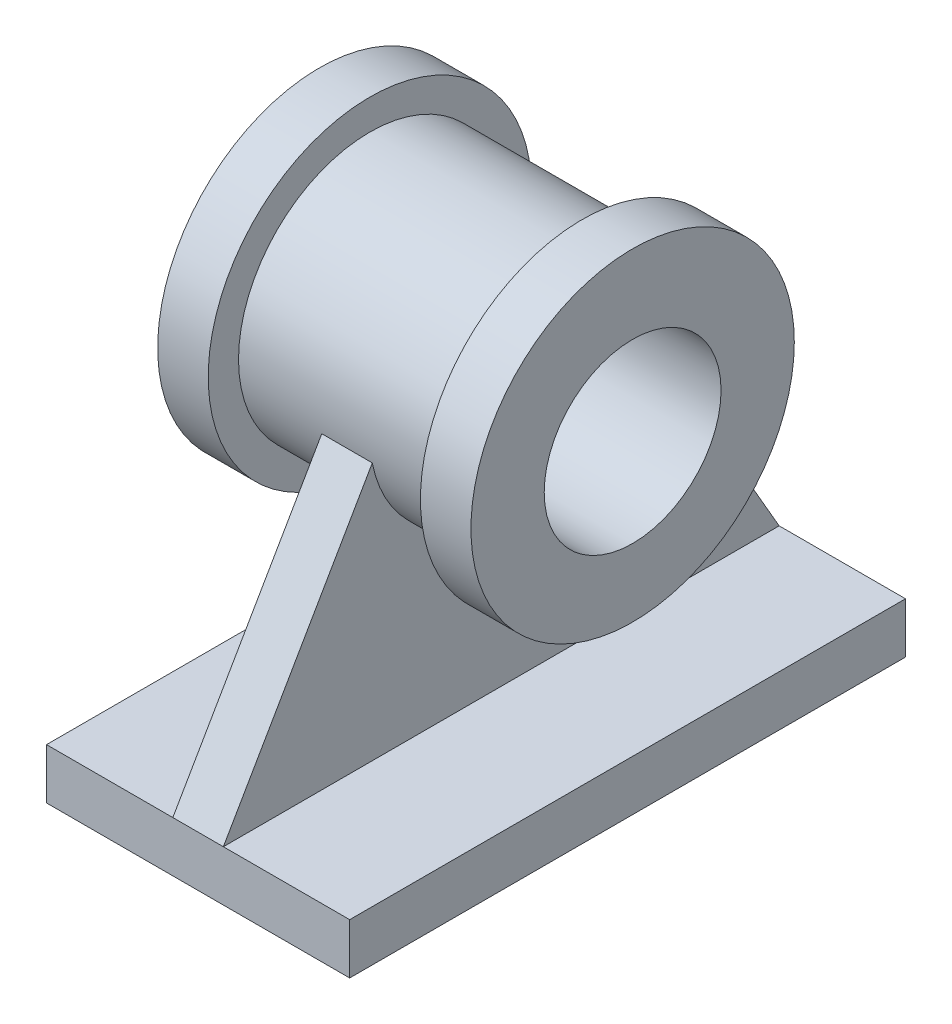
ISO-10303-21;
HEADER;
FILE_DESCRIPTION(('STEP AP214'),'2;1');
FILE_NAME('part.step','',(''),(''),'','','');
FILE_SCHEMA(('AUTOMOTIVE_DESIGN { 1 0 10303 214 1 1 1 1 }'));
ENDSEC;
DATA;
#1=APPLICATION_CONTEXT('core data for automotive mechanical design processes');
#2=APPLICATION_PROTOCOL_DEFINITION('international standard','automotive_design',2000,#1);
#3=PRODUCT_CONTEXT('',#1,'mechanical');
#4=PRODUCT('Part','Part','',(#3));
#5=PRODUCT_RELATED_PRODUCT_CATEGORY('part','',(#4));
#6=PRODUCT_DEFINITION_FORMATION('','',#4);
#7=PRODUCT_DEFINITION_CONTEXT('part definition',#1,'design');
#8=PRODUCT_DEFINITION('design','',#6,#7);
#9=PRODUCT_DEFINITION_SHAPE('','',#8);
#10=(LENGTH_UNIT() NAMED_UNIT(*) SI_UNIT(.MILLI.,.METRE.));
#11=(NAMED_UNIT(*) PLANE_ANGLE_UNIT() SI_UNIT($,.RADIAN.));
#12=(NAMED_UNIT(*) SI_UNIT($,.STERADIAN.) SOLID_ANGLE_UNIT());
#13=UNCERTAINTY_MEASURE_WITH_UNIT(LENGTH_MEASURE(1.E-05),#10,'distance_accuracy_value','');
#14=(GEOMETRIC_REPRESENTATION_CONTEXT(3) GLOBAL_UNCERTAINTY_ASSIGNED_CONTEXT((#13)) GLOBAL_UNIT_ASSIGNED_CONTEXT((#10,
#11,#12)) REPRESENTATION_CONTEXT('',''));
#15=CARTESIAN_POINT('',(0.,0.,0.));
#16=DIRECTION('',(0.,0.,1.));
#17=DIRECTION('',(1.,0.,0.));
#18=AXIS2_PLACEMENT_3D('',#15,#16,#17);
#19=CARTESIAN_POINT('',(5.,95.,-55.));
#20=DIRECTION('',(-1.,0.,0.));
#21=DIRECTION('',(0.,0.,1.));
#22=AXIS2_PLACEMENT_3D('',#19,#20,#21);
#23=PLANE('',#22);
#24=CARTESIAN_POINT('',(5.,66.,0.));
#25=DIRECTION('',(-1.,0.,0.));
#26=DIRECTION('',(0.,0.,1.));
#27=AXIS2_PLACEMENT_3D('',#24,#25,#26);
#28=CIRCLE('',#27,26.);
#29=CARTESIAN_POINT('',(5.,61.0523594579969,25.5249065241604));
#30=VERTEX_POINT('',#29);
#31=CARTESIAN_POINT('',(5.,61.0523594579969,-25.5249065241604));
#32=VERTEX_POINT('',#31);
#33=EDGE_CURVE('E51',#30,#32,#28,.F.);
#34=ORIENTED_EDGE('',*,*,#33,.F.);
#35=DIRECTION('',(0.,0.866025403784442,-0.499999999999995));
#36=VECTOR('',#35,1.);
#37=CARTESIAN_POINT('',(5.,10.,55.));
#38=LINE('',#37,#36);
#39=CARTESIAN_POINT('',(5.,10.,55.));
#40=VERTEX_POINT('',#39);
#41=EDGE_CURVE('E128',#40,#30,#38,.T.);
#42=ORIENTED_EDGE('',*,*,#41,.F.);
#43=DIRECTION('',(0.,0.,-1.));
#44=VECTOR('',#43,1.);
#45=CARTESIAN_POINT('',(5.,10.,-55.));
#46=LINE('',#45,#44);
#47=CARTESIAN_POINT('',(5.,10.,-55.));
#48=VERTEX_POINT('',#47);
#49=EDGE_CURVE('E139',#40,#48,#46,.T.);
#50=ORIENTED_EDGE('',*,*,#49,.T.);
#51=DIRECTION('',(0.,0.866025403784442,0.499999999999995));
#52=VECTOR('',#51,1.);
#53=CARTESIAN_POINT('',(5.,10.,-55.));
#54=LINE('',#53,#52);
#55=EDGE_CURVE('E133',#48,#32,#54,.T.);
#56=ORIENTED_EDGE('',*,*,#55,.T.);
#57=EDGE_LOOP('',(#34,#42,#50,#56));
#58=FACE_BOUND('',#57,.T.);
#59=ADVANCED_FACE('F35',(#58),#23,.F.);
#60=CARTESIAN_POINT('',(-5.,95.,-55.));
#61=DIRECTION('',(1.,0.,0.));
#62=DIRECTION('',(0.,0.,-1.));
#63=AXIS2_PLACEMENT_3D('',#60,#61,#62);
#64=PLANE('',#63);
#65=CARTESIAN_POINT('',(-5.,66.,0.));
#66=DIRECTION('',(1.,0.,0.));
#67=DIRECTION('',(0.,0.,-1.));
#68=AXIS2_PLACEMENT_3D('',#65,#66,#67);
#69=CIRCLE('',#68,26.);
#70=CARTESIAN_POINT('',(-5.,61.0523594579969,-25.5249065241604));
#71=VERTEX_POINT('',#70);
#72=CARTESIAN_POINT('',(-5.,61.0523594579969,25.5249065241604));
#73=VERTEX_POINT('',#72);
#74=EDGE_CURVE('E111',#71,#73,#69,.F.);
#75=ORIENTED_EDGE('',*,*,#74,.F.);
#76=DIRECTION('',(0.,0.866025403784442,0.499999999999995));
#77=VECTOR('',#76,1.);
#78=CARTESIAN_POINT('',(-5.,73.7500000000005,-18.1939203391616));
#79=LINE('',#78,#77);
#80=CARTESIAN_POINT('',(-5.,10.,-55.));
#81=VERTEX_POINT('',#80);
#82=EDGE_CURVE('E121',#81,#71,#79,.T.);
#83=ORIENTED_EDGE('',*,*,#82,.F.);
#84=DIRECTION('',(0.,0.,1.));
#85=VECTOR('',#84,1.);
#86=CARTESIAN_POINT('',(-5.,10.,-55.));
#87=LINE('',#86,#85);
#88=CARTESIAN_POINT('',(-5.,10.,55.));
#89=VERTEX_POINT('',#88);
#90=EDGE_CURVE('E142',#81,#89,#87,.T.);
#91=ORIENTED_EDGE('',*,*,#90,.T.);
#92=DIRECTION('',(0.,0.866025403784442,-0.499999999999995));
#93=VECTOR('',#92,1.);
#94=CARTESIAN_POINT('',(-5.,121.381397208144,-9.3060796608378));
#95=LINE('',#94,#93);
#96=EDGE_CURVE('E123',#89,#73,#95,.T.);
#97=ORIENTED_EDGE('',*,*,#96,.T.);
#98=EDGE_LOOP('',(#75,#83,#91,#97));
#99=FACE_BOUND('',#98,.T.);
#100=ADVANCED_FACE('F119',(#99),#64,.F.);
#101=CARTESIAN_POINT('',(-80.,10.,55.));
#102=DIRECTION('',(0.,-0.499999999999995,-0.866025403784442));
#103=DIRECTION('',(0.,0.866025403784442,-0.499999999999995));
#104=AXIS2_PLACEMENT_3D('',#101,#102,#103);
#105=PLANE('',#104);
#106=DIRECTION('',(-1.,0.,0.));
#107=VECTOR('',#106,1.);
#108=CARTESIAN_POINT('',(21.,61.0523594579969,25.5249065241604));
#109=LINE('',#108,#107);
#110=EDGE_CURVE('E192',#73,#30,#109,.F.);
#111=ORIENTED_EDGE('',*,*,#110,.F.);
#112=ORIENTED_EDGE('',*,*,#96,.F.);
#113=DIRECTION('',(1.,0.,0.));
#114=VECTOR('',#113,1.);
#115=CARTESIAN_POINT('',(-80.,10.,55.));
#116=LINE('',#115,#114);
#117=EDGE_CURVE('E131',#89,#40,#116,.T.);
#118=ORIENTED_EDGE('',*,*,#117,.T.);
#119=ORIENTED_EDGE('',*,*,#41,.T.);
#120=EDGE_LOOP('',(#111,#112,#118,#119));
#121=FACE_BOUND('',#120,.T.);
#122=ADVANCED_FACE('F191',(#121),#105,.F.);
#123=CARTESIAN_POINT('',(-80.,10.,-55.));
#124=DIRECTION('',(0.,0.499999999999995,-0.866025403784442));
#125=DIRECTION('',(0.,0.866025403784442,0.499999999999995));
#126=AXIS2_PLACEMENT_3D('',#123,#124,#125);
#127=PLANE('',#126);
#128=ORIENTED_EDGE('',*,*,#82,.T.);
#129=DIRECTION('',(-1.,0.,0.));
#130=VECTOR('',#129,1.);
#131=CARTESIAN_POINT('',(21.,61.0523594579969,-25.5249065241604));
#132=LINE('',#131,#130);
#133=EDGE_CURVE('E11',#71,#32,#132,.F.);
#134=ORIENTED_EDGE('',*,*,#133,.T.);
#135=ORIENTED_EDGE('',*,*,#55,.F.);
#136=DIRECTION('',(1.,0.,0.));
#137=VECTOR('',#136,1.);
#138=CARTESIAN_POINT('',(-80.,10.,-55.));
#139=LINE('',#138,#137);
#140=EDGE_CURVE('E127',#81,#48,#139,.T.);
#141=ORIENTED_EDGE('',*,*,#140,.F.);
#142=EDGE_LOOP('',(#128,#134,#135,#141));
#143=FACE_BOUND('',#142,.T.);
#144=ADVANCED_FACE('F126',(#143),#127,.T.);
#145=CARTESIAN_POINT('',(-30.,10.,-55.));
#146=DIRECTION('',(0.,0.,1.));
#147=DIRECTION('',(1.,0.,0.));
#148=AXIS2_PLACEMENT_3D('',#145,#146,#147);
#149=PLANE('',#148);
#150=ORIENTED_EDGE('',*,*,#140,.T.);
#151=DIRECTION('',(-1.,0.,0.));
#152=VECTOR('',#151,1.);
#153=CARTESIAN_POINT('',(-30.,10.,-55.));
#154=LINE('',#153,#152);
#155=CARTESIAN_POINT('',(30.,10.,-55.));
#156=VERTEX_POINT('',#155);
#157=EDGE_CURVE('E89',#156,#48,#154,.T.);
#158=ORIENTED_EDGE('',*,*,#157,.F.);
#159=DIRECTION('',(0.,-1.,0.));
#160=VECTOR('',#159,1.);
#161=CARTESIAN_POINT('',(30.,10.,-55.));
#162=LINE('',#161,#160);
#163=CARTESIAN_POINT('',(30.,0.,-55.));
#164=VERTEX_POINT('',#163);
#165=EDGE_CURVE('E44',#156,#164,#162,.T.);
#166=ORIENTED_EDGE('',*,*,#165,.T.);
#167=DIRECTION('',(-1.,0.,0.));
#168=VECTOR('',#167,1.);
#169=CARTESIAN_POINT('',(-30.,0.,-55.));
#170=LINE('',#169,#168);
#171=CARTESIAN_POINT('',(-30.,0.,-55.));
#172=VERTEX_POINT('',#171);
#173=EDGE_CURVE('E157',#164,#172,#170,.T.);
#174=ORIENTED_EDGE('',*,*,#173,.T.);
#175=DIRECTION('',(0.,-1.,0.));
#176=VECTOR('',#175,1.);
#177=CARTESIAN_POINT('',(-30.,10.,-55.));
#178=LINE('',#177,#176);
#179=CARTESIAN_POINT('',(-30.,10.,-55.));
#180=VERTEX_POINT('',#179);
#181=EDGE_CURVE('E165',#180,#172,#178,.T.);
#182=ORIENTED_EDGE('',*,*,#181,.F.);
#183=EDGE_CURVE('E147',#81,#180,#154,.T.);
#184=ORIENTED_EDGE('',*,*,#183,.F.);
#185=EDGE_LOOP('',(#150,#158,#166,#174,#182,#184));
#186=FACE_BOUND('',#185,.T.);
#187=ADVANCED_FACE('F169',(#186),#149,.F.);
#188=CARTESIAN_POINT('',(0.,10.,0.));
#189=DIRECTION('',(0.,1.,0.));
#190=DIRECTION('',(0.,0.,1.));
#191=AXIS2_PLACEMENT_3D('',#188,#189,#190);
#192=PLANE('',#191);
#193=ORIENTED_EDGE('',*,*,#49,.F.);
#194=DIRECTION('',(1.,0.,0.));
#195=VECTOR('',#194,1.);
#196=CARTESIAN_POINT('',(-30.,10.,55.));
#197=LINE('',#196,#195);
#198=CARTESIAN_POINT('',(30.,10.,55.));
#199=VERTEX_POINT('',#198);
#200=EDGE_CURVE('E59',#40,#199,#197,.T.);
#201=ORIENTED_EDGE('',*,*,#200,.T.);
#202=DIRECTION('',(0.,0.,-1.));
#203=VECTOR('',#202,1.);
#204=CARTESIAN_POINT('',(30.,10.,-55.));
#205=LINE('',#204,#203);
#206=EDGE_CURVE('E145',#199,#156,#205,.T.);
#207=ORIENTED_EDGE('',*,*,#206,.T.);
#208=ORIENTED_EDGE('',*,*,#157,.T.);
#209=EDGE_LOOP('',(#193,#201,#207,#208));
#210=FACE_BOUND('',#209,.T.);
#211=ADVANCED_FACE('F187',(#210),#192,.T.);
#212=CARTESIAN_POINT('',(30.,10.,-55.));
#213=DIRECTION('',(-1.,0.,0.));
#214=DIRECTION('',(0.,0.,1.));
#215=AXIS2_PLACEMENT_3D('',#212,#213,#214);
#216=PLANE('',#215);
#217=DIRECTION('',(0.,0.,-1.));
#218=VECTOR('',#217,1.);
#219=CARTESIAN_POINT('',(30.,0.,-55.));
#220=LINE('',#219,#218);
#221=CARTESIAN_POINT('',(30.,0.,55.));
#222=VERTEX_POINT('',#221);
#223=EDGE_CURVE('E144',#222,#164,#220,.T.);
#224=ORIENTED_EDGE('',*,*,#223,.T.);
#225=ORIENTED_EDGE('',*,*,#165,.F.);
#226=ORIENTED_EDGE('',*,*,#206,.F.);
#227=DIRECTION('',(0.,-1.,0.));
#228=VECTOR('',#227,1.);
#229=CARTESIAN_POINT('',(30.,10.,55.));
#230=LINE('',#229,#228);
#231=EDGE_CURVE('E154',#199,#222,#230,.T.);
#232=ORIENTED_EDGE('',*,*,#231,.T.);
#233=EDGE_LOOP('',(#224,#225,#226,#232));
#234=FACE_BOUND('',#233,.T.);
#235=ADVANCED_FACE('F37',(#234),#216,.F.);
#236=CARTESIAN_POINT('',(-30.,10.,-55.));
#237=DIRECTION('',(1.,0.,0.));
#238=DIRECTION('',(0.,0.,-1.));
#239=AXIS2_PLACEMENT_3D('',#236,#237,#238);
#240=PLANE('',#239);
#241=DIRECTION('',(0.,0.,1.));
#242=VECTOR('',#241,1.);
#243=CARTESIAN_POINT('',(-30.,0.,-55.));
#244=LINE('',#243,#242);
#245=CARTESIAN_POINT('',(-30.,0.,55.));
#246=VERTEX_POINT('',#245);
#247=EDGE_CURVE('E159',#172,#246,#244,.T.);
#248=ORIENTED_EDGE('',*,*,#247,.T.);
#249=DIRECTION('',(0.,-1.,0.));
#250=VECTOR('',#249,1.);
#251=CARTESIAN_POINT('',(-30.,10.,55.));
#252=LINE('',#251,#250);
#253=CARTESIAN_POINT('',(-30.,10.,55.));
#254=VERTEX_POINT('',#253);
#255=EDGE_CURVE('E163',#254,#246,#252,.T.);
#256=ORIENTED_EDGE('',*,*,#255,.F.);
#257=DIRECTION('',(0.,0.,1.));
#258=VECTOR('',#257,1.);
#259=CARTESIAN_POINT('',(-30.,10.,-55.));
#260=LINE('',#259,#258);
#261=EDGE_CURVE('E149',#180,#254,#260,.T.);
#262=ORIENTED_EDGE('',*,*,#261,.F.);
#263=ORIENTED_EDGE('',*,*,#181,.T.);
#264=EDGE_LOOP('',(#248,#256,#262,#263));
#265=FACE_BOUND('',#264,.T.);
#266=ADVANCED_FACE('F179',(#265),#240,.F.);
#267=CARTESIAN_POINT('',(-30.,10.,55.));
#268=DIRECTION('',(0.,0.,-1.));
#269=DIRECTION('',(-1.,0.,0.));
#270=AXIS2_PLACEMENT_3D('',#267,#268,#269);
#271=PLANE('',#270);
#272=ORIENTED_EDGE('',*,*,#200,.F.);
#273=ORIENTED_EDGE('',*,*,#117,.F.);
#274=EDGE_CURVE('E151',#254,#89,#197,.T.);
#275=ORIENTED_EDGE('',*,*,#274,.F.);
#276=ORIENTED_EDGE('',*,*,#255,.T.);
#277=DIRECTION('',(1.,0.,0.));
#278=VECTOR('',#277,1.);
#279=CARTESIAN_POINT('',(-30.,0.,55.));
#280=LINE('',#279,#278);
#281=EDGE_CURVE('E81',#246,#222,#280,.T.);
#282=ORIENTED_EDGE('',*,*,#281,.T.);
#283=ORIENTED_EDGE('',*,*,#231,.F.);
#284=EDGE_LOOP('',(#272,#273,#275,#276,#282,#283));
#285=FACE_BOUND('',#284,.T.);
#286=ADVANCED_FACE('F182',(#285),#271,.F.);
#287=ORIENTED_EDGE('',*,*,#90,.F.);
#288=ORIENTED_EDGE('',*,*,#183,.T.);
#289=ORIENTED_EDGE('',*,*,#261,.T.);
#290=ORIENTED_EDGE('',*,*,#274,.T.);
#291=EDGE_LOOP('',(#287,#288,#289,#290));
#292=FACE_BOUND('',#291,.T.);
#293=ADVANCED_FACE('F185',(#292),#192,.T.);
#294=CARTESIAN_POINT('',(0.,0.,0.));
#295=DIRECTION('',(0.,1.,0.));
#296=DIRECTION('',(0.,0.,1.));
#297=AXIS2_PLACEMENT_3D('',#294,#295,#296);
#298=PLANE('',#297);
#299=ORIENTED_EDGE('',*,*,#223,.F.);
#300=ORIENTED_EDGE('',*,*,#281,.F.);
#301=ORIENTED_EDGE('',*,*,#247,.F.);
#302=ORIENTED_EDGE('',*,*,#173,.F.);
#303=EDGE_LOOP('',(#299,#300,#301,#302));
#304=FACE_BOUND('',#303,.T.);
#305=ADVANCED_FACE('F175',(#304),#298,.F.);
#306=CARTESIAN_POINT('',(21.,66.,0.));
#307=DIRECTION('',(-1.,0.,0.));
#308=DIRECTION('',(0.,0.,1.));
#309=AXIS2_PLACEMENT_3D('',#306,#307,#308);
#310=CYLINDRICAL_SURFACE('',#309,26.);
#311=CARTESIAN_POINT('',(-21.,66.,0.));
#312=DIRECTION('',(1.,0.,0.));
#313=DIRECTION('',(0.,0.,-1.));
#314=AXIS2_PLACEMENT_3D('',#311,#312,#313);
#315=CIRCLE('',#314,26.);
#316=CARTESIAN_POINT('',(-21.,66.,-26.));
#317=VERTEX_POINT('',#316);
#318=EDGE_CURVE('E196',#317,#317,#315,.T.);
#319=ORIENTED_EDGE('',*,*,#318,.T.);
#320=EDGE_LOOP('',(#319));
#321=FACE_BOUND('',#320,.T.);
#322=CARTESIAN_POINT('',(21.,66.,0.));
#323=DIRECTION('',(1.,0.,0.));
#324=DIRECTION('',(0.,0.,-1.));
#325=AXIS2_PLACEMENT_3D('',#322,#323,#324);
#326=CIRCLE('',#325,26.);
#327=CARTESIAN_POINT('',(21.,66.,-26.));
#328=VERTEX_POINT('',#327);
#329=EDGE_CURVE('E124',#328,#328,#326,.T.);
#330=ORIENTED_EDGE('',*,*,#329,.F.);
#331=EDGE_LOOP('',(#330));
#332=FACE_BOUND('',#331,.T.);
#333=ORIENTED_EDGE('',*,*,#74,.T.);
#334=ORIENTED_EDGE('',*,*,#110,.T.);
#335=ORIENTED_EDGE('',*,*,#33,.T.);
#336=ORIENTED_EDGE('',*,*,#133,.F.);
#337=EDGE_LOOP('',(#333,#334,#335,#336));
#338=FACE_BOUND('',#337,.T.);
#339=ADVANCED_FACE('F110',(#321,#332,#338),#310,.T.);
#340=CARTESIAN_POINT('',(31.,66.,0.));
#341=DIRECTION('',(-1.,0.,0.));
#342=DIRECTION('',(0.,0.,1.));
#343=AXIS2_PLACEMENT_3D('',#340,#341,#342);
#344=CYLINDRICAL_SURFACE('',#343,32.);
#345=CARTESIAN_POINT('',(31.,66.,0.));
#346=DIRECTION('',(1.,0.,0.));
#347=DIRECTION('',(0.,0.,-1.));
#348=AXIS2_PLACEMENT_3D('',#345,#346,#347);
#349=CIRCLE('',#348,32.);
#350=CARTESIAN_POINT('',(31.,66.,-32.));
#351=VERTEX_POINT('',#350);
#352=EDGE_CURVE('E203',#351,#351,#349,.T.);
#353=ORIENTED_EDGE('',*,*,#352,.F.);
#354=EDGE_LOOP('',(#353));
#355=FACE_BOUND('',#354,.T.);
#356=CARTESIAN_POINT('',(21.,66.,0.));
#357=DIRECTION('',(1.,0.,0.));
#358=DIRECTION('',(0.,0.,-1.));
#359=AXIS2_PLACEMENT_3D('',#356,#357,#358);
#360=CIRCLE('',#359,32.);
#361=CARTESIAN_POINT('',(21.,66.,-32.));
#362=VERTEX_POINT('',#361);
#363=EDGE_CURVE('E199',#362,#362,#360,.T.);
#364=ORIENTED_EDGE('',*,*,#363,.T.);
#365=EDGE_LOOP('',(#364));
#366=FACE_BOUND('',#365,.T.);
#367=ADVANCED_FACE('F271',(#355,#366),#344,.T.);
#368=CARTESIAN_POINT('',(31.,66.,0.));
#369=DIRECTION('',(1.,0.,0.));
#370=DIRECTION('',(0.,0.,-1.));
#371=AXIS2_PLACEMENT_3D('',#368,#369,#370);
#372=PLANE('',#371);
#373=CARTESIAN_POINT('',(31.,64.9672699296076,0.));
#374=DIRECTION('',(1.,0.,0.));
#375=DIRECTION('',(0.,0.,-1.));
#376=AXIS2_PLACEMENT_3D('',#373,#374,#375);
#377=CIRCLE('',#376,17.5);
#378=CARTESIAN_POINT('',(31.,64.9672699296076,-17.5));
#379=VERTEX_POINT('',#378);
#380=EDGE_CURVE('E213',#379,#379,#377,.T.);
#381=ORIENTED_EDGE('',*,*,#380,.F.);
#382=EDGE_LOOP('',(#381));
#383=FACE_BOUND('',#382,.T.);
#384=ORIENTED_EDGE('',*,*,#352,.T.);
#385=EDGE_LOOP('',(#384));
#386=FACE_BOUND('',#385,.T.);
#387=ADVANCED_FACE('F275',(#383,#386),#372,.T.);
#388=CARTESIAN_POINT('',(21.,66.,0.));
#389=DIRECTION('',(1.,0.,0.));
#390=DIRECTION('',(0.,0.,-1.));
#391=AXIS2_PLACEMENT_3D('',#388,#389,#390);
#392=PLANE('',#391);
#393=ORIENTED_EDGE('',*,*,#329,.T.);
#394=EDGE_LOOP('',(#393));
#395=FACE_BOUND('',#394,.T.);
#396=ORIENTED_EDGE('',*,*,#363,.F.);
#397=EDGE_LOOP('',(#396));
#398=FACE_BOUND('',#397,.T.);
#399=ADVANCED_FACE('F232',(#395,#398),#392,.F.);
#400=CARTESIAN_POINT('',(-31.,66.,0.));
#401=DIRECTION('',(1.,0.,0.));
#402=DIRECTION('',(0.,0.,-1.));
#403=AXIS2_PLACEMENT_3D('',#400,#401,#402);
#404=CYLINDRICAL_SURFACE('',#403,32.);
#405=CARTESIAN_POINT('',(-31.,66.,0.));
#406=DIRECTION('',(1.,0.,0.));
#407=DIRECTION('',(0.,0.,-1.));
#408=AXIS2_PLACEMENT_3D('',#405,#406,#407);
#409=CIRCLE('',#408,32.);
#410=CARTESIAN_POINT('',(-31.,66.,-32.));
#411=VERTEX_POINT('',#410);
#412=EDGE_CURVE('E200',#411,#411,#409,.T.);
#413=ORIENTED_EDGE('',*,*,#412,.T.);
#414=EDGE_LOOP('',(#413));
#415=FACE_BOUND('',#414,.T.);
#416=CARTESIAN_POINT('',(-21.,66.,0.));
#417=DIRECTION('',(1.,0.,0.));
#418=DIRECTION('',(0.,0.,-1.));
#419=AXIS2_PLACEMENT_3D('',#416,#417,#418);
#420=CIRCLE('',#419,32.);
#421=CARTESIAN_POINT('',(-21.,66.,-32.));
#422=VERTEX_POINT('',#421);
#423=EDGE_CURVE('E208',#422,#422,#420,.T.);
#424=ORIENTED_EDGE('',*,*,#423,.F.);
#425=EDGE_LOOP('',(#424));
#426=FACE_BOUND('',#425,.T.);
#427=ADVANCED_FACE('F226',(#415,#426),#404,.T.);
#428=CARTESIAN_POINT('',(-31.,66.,0.));
#429=DIRECTION('',(-1.,0.,0.));
#430=DIRECTION('',(0.,0.,-1.));
#431=AXIS2_PLACEMENT_3D('',#428,#429,#430);
#432=PLANE('',#431);
#433=CARTESIAN_POINT('',(-31.,64.9672699296076,0.));
#434=DIRECTION('',(-1.,0.,0.));
#435=DIRECTION('',(0.,0.,1.));
#436=AXIS2_PLACEMENT_3D('',#433,#434,#435);
#437=CIRCLE('',#436,17.5);
#438=CARTESIAN_POINT('',(-31.,64.9672699296076,17.5));
#439=VERTEX_POINT('',#438);
#440=EDGE_CURVE('E39',#439,#439,#437,.T.);
#441=ORIENTED_EDGE('',*,*,#440,.F.);
#442=EDGE_LOOP('',(#441));
#443=FACE_BOUND('',#442,.T.);
#444=ORIENTED_EDGE('',*,*,#412,.F.);
#445=EDGE_LOOP('',(#444));
#446=FACE_BOUND('',#445,.T.);
#447=ADVANCED_FACE('F222',(#443,#446),#432,.T.);
#448=CARTESIAN_POINT('',(-21.,66.,0.));
#449=DIRECTION('',(-1.,0.,0.));
#450=DIRECTION('',(0.,0.,-1.));
#451=AXIS2_PLACEMENT_3D('',#448,#449,#450);
#452=PLANE('',#451);
#453=ORIENTED_EDGE('',*,*,#318,.F.);
#454=EDGE_LOOP('',(#453));
#455=FACE_BOUND('',#454,.T.);
#456=ORIENTED_EDGE('',*,*,#423,.T.);
#457=EDGE_LOOP('',(#456));
#458=FACE_BOUND('',#457,.T.);
#459=ADVANCED_FACE('F225',(#455,#458),#452,.F.);
#460=CARTESIAN_POINT('',(-50.,64.9672699296076,0.));
#461=DIRECTION('',(1.,0.,0.));
#462=DIRECTION('',(0.,0.,-1.));
#463=AXIS2_PLACEMENT_3D('',#460,#461,#462);
#464=CYLINDRICAL_SURFACE('',#463,17.5);
#465=ORIENTED_EDGE('',*,*,#440,.T.);
#466=EDGE_LOOP('',(#465));
#467=FACE_BOUND('',#466,.T.);
#468=ORIENTED_EDGE('',*,*,#380,.T.);
#469=EDGE_LOOP('',(#468));
#470=FACE_BOUND('',#469,.T.);
#471=ADVANCED_FACE('F220',(#467,#470),#464,.F.);
#472=CLOSED_SHELL('',(#59,#100,#122,#144,#187,#211,#235,#266,#286,#293,#305,#339,#367,#387,#399,
#427,#447,#459,#471));
#473=MANIFOLD_SOLID_BREP('B2',#472);
#474=ADVANCED_BREP_SHAPE_REPRESENTATION('',(#18,#473),#14);
#475=SHAPE_DEFINITION_REPRESENTATION(#9,#474);
ENDSEC;
END-ISO-10303-21;
